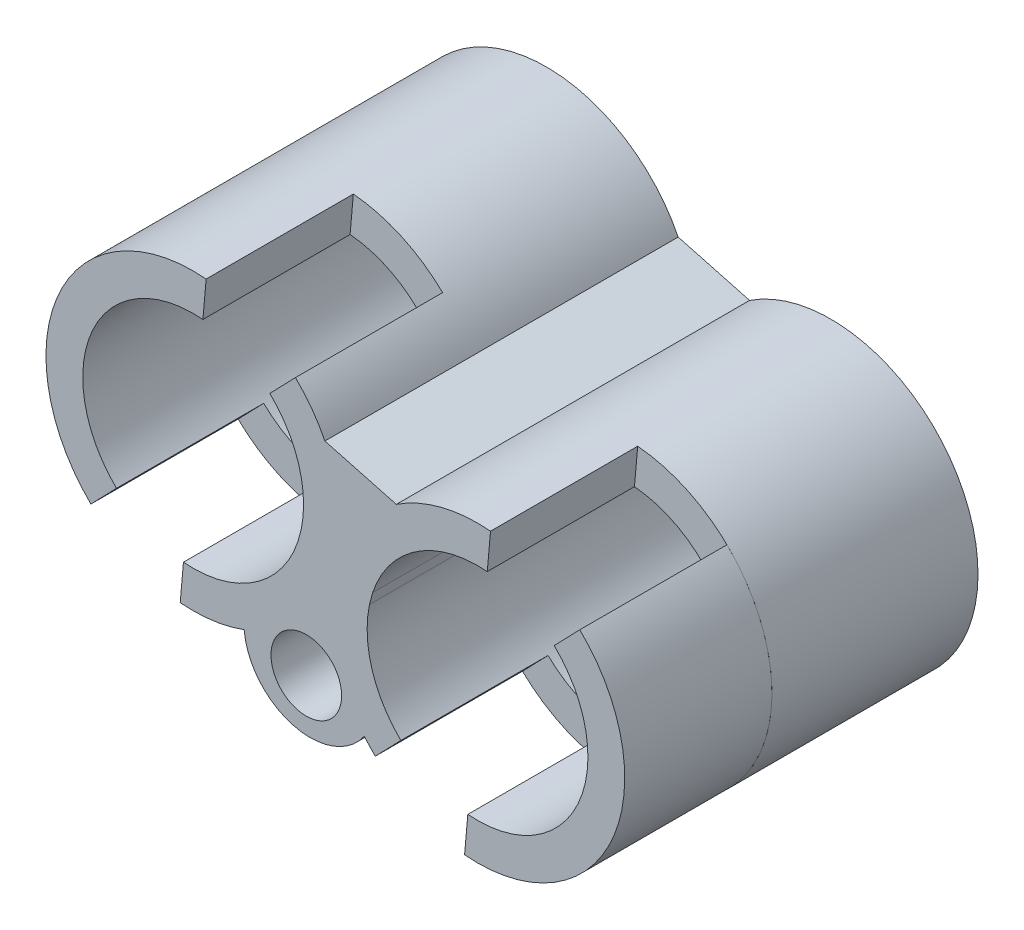
ISO-10303-21;
HEADER;
FILE_DESCRIPTION(('STEP AP214'),'2;1');
FILE_NAME('part.step','',(''),(''),'','','');
FILE_SCHEMA(('AUTOMOTIVE_DESIGN { 1 0 10303 214 1 1 1 1 }'));
ENDSEC;
DATA;
#1=APPLICATION_CONTEXT('core data for automotive mechanical design processes');
#2=APPLICATION_PROTOCOL_DEFINITION('international standard','automotive_design',2000,#1);
#3=PRODUCT_CONTEXT('',#1,'mechanical');
#4=PRODUCT('Part','Part','',(#3));
#5=PRODUCT_RELATED_PRODUCT_CATEGORY('part','',(#4));
#6=PRODUCT_DEFINITION_FORMATION('','',#4);
#7=PRODUCT_DEFINITION_CONTEXT('part definition',#1,'design');
#8=PRODUCT_DEFINITION('design','',#6,#7);
#9=PRODUCT_DEFINITION_SHAPE('','',#8);
#10=(LENGTH_UNIT() NAMED_UNIT(*) SI_UNIT(.MILLI.,.METRE.));
#11=(NAMED_UNIT(*) PLANE_ANGLE_UNIT() SI_UNIT($,.RADIAN.));
#12=(NAMED_UNIT(*) SI_UNIT($,.STERADIAN.) SOLID_ANGLE_UNIT());
#13=UNCERTAINTY_MEASURE_WITH_UNIT(LENGTH_MEASURE(1.E-05),#10,'distance_accuracy_value','');
#14=(GEOMETRIC_REPRESENTATION_CONTEXT(3) GLOBAL_UNCERTAINTY_ASSIGNED_CONTEXT((#13)) GLOBAL_UNIT_ASSIGNED_CONTEXT((#10,
#11,#12)) REPRESENTATION_CONTEXT('',''));
#15=CARTESIAN_POINT('',(0.,0.,0.));
#16=DIRECTION('',(0.,0.,1.));
#17=DIRECTION('',(1.,0.,0.));
#18=AXIS2_PLACEMENT_3D('',#15,#16,#17);
#19=CARTESIAN_POINT('',(19.3185165257814,-5.17638090205016,24.));
#20=DIRECTION('',(0.,0.,-1.));
#21=DIRECTION('',(-1.,0.,0.));
#22=AXIS2_PLACEMENT_3D('',#19,#20,#21);
#23=CYLINDRICAL_SURFACE('',#22,7.5);
#24=CARTESIAN_POINT('',(19.3185165257814,-5.17638090205016,14.));
#25=DIRECTION('',(0.,0.,1.));
#26=DIRECTION('',(1.,0.,0.));
#27=AXIS2_PLACEMENT_3D('',#24,#25,#26);
#28=CIRCLE('',#27,7.5);
#29=CARTESIAN_POINT('',(18.6579738156018,-12.6472364974976,14.));
#30=VERTEX_POINT('',#29);
#31=CARTESIAN_POINT('',(24.5279987695268,0.219107468069976,14.));
#32=VERTEX_POINT('',#31);
#33=EDGE_CURVE('E185',#30,#32,#28,.T.);
#34=ORIENTED_EDGE('',*,*,#33,.F.);
#35=DIRECTION('',(0.,0.,-1.));
#36=VECTOR('',#35,1.);
#37=CARTESIAN_POINT('',(18.6579738156018,-12.6472364974976,24.));
#38=LINE('',#37,#36);
#39=CARTESIAN_POINT('',(18.6579738156018,-12.6472364974976,24.));
#40=VERTEX_POINT('',#39);
#41=EDGE_CURVE('E13',#40,#30,#38,.T.);
#42=ORIENTED_EDGE('',*,*,#41,.F.);
#43=CARTESIAN_POINT('',(19.3185165257814,-5.17638090205016,24.));
#44=DIRECTION('',(0.,0.,1.));
#45=DIRECTION('',(1.,0.,0.));
#46=AXIS2_PLACEMENT_3D('',#43,#44,#45);
#47=CIRCLE('',#46,7.5);
#48=CARTESIAN_POINT('',(24.5279987695268,0.219107468069976,24.));
#49=VERTEX_POINT('',#48);
#50=EDGE_CURVE('E170',#40,#49,#47,.T.);
#51=ORIENTED_EDGE('',*,*,#50,.T.);
#52=DIRECTION('',(0.,0.,-1.));
#53=VECTOR('',#52,1.);
#54=CARTESIAN_POINT('',(24.5279987695268,0.219107468069976,24.));
#55=LINE('',#54,#53);
#56=EDGE_CURVE('E138',#49,#32,#55,.T.);
#57=ORIENTED_EDGE('',*,*,#56,.T.);
#58=EDGE_LOOP('',(#34,#42,#51,#57));
#59=FACE_BOUND('',#58,.T.);
#60=ADVANCED_FACE('F122',(#59),#23,.F.);
#61=CARTESIAN_POINT('',(19.6227923130935,-1.73496760179407,24.));
#62=DIRECTION('',(0.996114079392994,-0.0880723613572872,0.));
#63=DIRECTION('',(0.0880723613572872,0.996114079392994,0.));
#64=AXIS2_PLACEMENT_3D('',#61,#62,#63);
#65=PLANE('',#64);
#66=DIRECTION('',(-0.0880723613572873,-0.996114079392994,0.));
#67=VECTOR('',#66,1.);
#68=CARTESIAN_POINT('',(19.6227923130935,-1.73496760179407,14.));
#69=LINE('',#68,#67);
#70=CARTESIAN_POINT('',(18.4377929122086,-15.1375216959801,14.));
#71=VERTEX_POINT('',#70);
#72=EDGE_CURVE('E176',#30,#71,#69,.T.);
#73=ORIENTED_EDGE('',*,*,#72,.T.);
#74=DIRECTION('',(0.,0.,-1.));
#75=VECTOR('',#74,1.);
#76=CARTESIAN_POINT('',(18.4377929122086,-15.1375216959801,24.));
#77=LINE('',#76,#75);
#78=CARTESIAN_POINT('',(18.4377929122086,-15.1375216959801,24.));
#79=VERTEX_POINT('',#78);
#80=EDGE_CURVE('E130',#79,#71,#77,.T.);
#81=ORIENTED_EDGE('',*,*,#80,.F.);
#82=DIRECTION('',(-0.0880723613572873,-0.996114079392994,0.));
#83=VECTOR('',#82,1.);
#84=CARTESIAN_POINT('',(19.6227923130935,-1.73496760179407,24.));
#85=LINE('',#84,#83);
#86=EDGE_CURVE('E164',#40,#79,#85,.T.);
#87=ORIENTED_EDGE('',*,*,#86,.F.);
#88=ORIENTED_EDGE('',*,*,#41,.T.);
#89=EDGE_LOOP('',(#73,#81,#87,#88));
#90=FACE_BOUND('',#89,.T.);
#91=ADVANCED_FACE('F174',(#90),#65,.F.);
#92=CARTESIAN_POINT('',(19.3185165257814,-5.17638090205016,24.));
#93=DIRECTION('',(0.,0.,-1.));
#94=DIRECTION('',(-1.,0.,0.));
#95=AXIS2_PLACEMENT_3D('',#92,#93,#94);
#96=CYLINDRICAL_SURFACE('',#95,10.);
#97=CARTESIAN_POINT('',(19.3185165257814,-5.17638090205016,14.));
#98=DIRECTION('',(0.,0.,1.));
#99=DIRECTION('',(1.,0.,0.));
#100=AXIS2_PLACEMENT_3D('',#97,#98,#99);
#101=CIRCLE('',#100,10.);
#102=CARTESIAN_POINT('',(26.2644928507753,2.01760359144336,14.));
#103=VERTEX_POINT('',#102);
#104=EDGE_CURVE('E188',#71,#103,#101,.T.);
#105=ORIENTED_EDGE('',*,*,#104,.T.);
#106=DIRECTION('',(0.,0.,-1.));
#107=VECTOR('',#106,1.);
#108=CARTESIAN_POINT('',(26.2644928507753,2.01760359144336,24.));
#109=LINE('',#108,#107);
#110=CARTESIAN_POINT('',(26.2644928507753,2.01760359144336,24.));
#111=VERTEX_POINT('',#110);
#112=EDGE_CURVE('E152',#111,#103,#109,.T.);
#113=ORIENTED_EDGE('',*,*,#112,.F.);
#114=CARTESIAN_POINT('',(19.3185165257814,-5.17638090205016,24.));
#115=DIRECTION('',(0.,0.,1.));
#116=DIRECTION('',(1.,0.,0.));
#117=AXIS2_PLACEMENT_3D('',#114,#115,#116);
#118=CIRCLE('',#117,10.);
#119=EDGE_CURVE('E169',#79,#111,#118,.T.);
#120=ORIENTED_EDGE('',*,*,#119,.F.);
#121=ORIENTED_EDGE('',*,*,#80,.T.);
#122=EDGE_LOOP('',(#105,#113,#120,#121));
#123=FACE_BOUND('',#122,.T.);
#124=ADVANCED_FACE('F179',(#123),#96,.T.);
#125=CARTESIAN_POINT('',(12.5845901278236,-12.1507441622472,24.));
#126=DIRECTION('',(-0.719398449349352,0.694597632499383,0.));
#127=DIRECTION('',(-0.694597632499383,-0.719398449349352,0.));
#128=AXIS2_PLACEMENT_3D('',#125,#126,#127);
#129=PLANE('',#128);
#130=DIRECTION('',(0.694597632499383,0.719398449349352,0.));
#131=VECTOR('',#130,1.);
#132=CARTESIAN_POINT('',(12.5845901278236,-12.1507441622472,14.));
#133=LINE('',#132,#131);
#134=EDGE_CURVE('E190',#32,#103,#133,.T.);
#135=ORIENTED_EDGE('',*,*,#134,.F.);
#136=ORIENTED_EDGE('',*,*,#56,.F.);
#137=DIRECTION('',(0.694597632499383,0.719398449349352,0.));
#138=VECTOR('',#137,1.);
#139=CARTESIAN_POINT('',(12.5845901278236,-12.1507441622472,24.));
#140=LINE('',#139,#138);
#141=EDGE_CURVE('E180',#49,#111,#140,.T.);
#142=ORIENTED_EDGE('',*,*,#141,.T.);
#143=ORIENTED_EDGE('',*,*,#112,.T.);
#144=EDGE_LOOP('',(#135,#136,#142,#143));
#145=FACE_BOUND('',#144,.T.);
#146=ADVANCED_FACE('F195',(#145),#129,.T.);
#147=CARTESIAN_POINT('',(0.,0.,24.));
#148=DIRECTION('',(0.,0.,1.));
#149=DIRECTION('',(1.,0.,0.));
#150=AXIS2_PLACEMENT_3D('',#147,#148,#149);
#151=PLANE('',#150);
#152=ORIENTED_EDGE('',*,*,#50,.F.);
#153=ORIENTED_EDGE('',*,*,#86,.T.);
#154=ORIENTED_EDGE('',*,*,#119,.T.);
#155=ORIENTED_EDGE('',*,*,#141,.F.);
#156=EDGE_LOOP('',(#152,#153,#154,#155));
#157=FACE_BOUND('',#156,.T.);
#158=ADVANCED_FACE('F166',(#157),#151,.T.);
#159=CARTESIAN_POINT('',(0.,0.,14.));
#160=DIRECTION('',(0.,0.,1.));
#161=DIRECTION('',(1.,0.,0.));
#162=AXIS2_PLACEMENT_3D('',#159,#160,#161);
#163=PLANE('',#162);
#164=ORIENTED_EDGE('',*,*,#33,.T.);
#165=ORIENTED_EDGE('',*,*,#134,.T.);
#166=ORIENTED_EDGE('',*,*,#104,.F.);
#167=ORIENTED_EDGE('',*,*,#72,.F.);
#168=EDGE_LOOP('',(#164,#165,#166,#167));
#169=FACE_BOUND('',#168,.T.);
#170=ADVANCED_FACE('F202',(#169),#163,.F.);
#171=CLOSED_SHELL('',(#60,#91,#124,#146,#158,#170));
#172=MANIFOLD_SOLID_BREP('B2',#171);
#173=CARTESIAN_POINT('',(0.,0.,14.));
#174=DIRECTION('',(0.,0.,1.));
#175=DIRECTION('',(1.,0.,0.));
#176=AXIS2_PLACEMENT_3D('',#173,#174,#175);
#177=PLANE('',#176);
#178=CARTESIAN_POINT('',(19.3185165257814,-5.17638090205016,14.));
#179=DIRECTION('',(0.,0.,1.));
#180=DIRECTION('',(1.,0.,0.));
#181=AXIS2_PLACEMENT_3D('',#178,#179,#180);
#182=CIRCLE('',#181,10.);
#183=CARTESIAN_POINT('',(12.3725402007876,-12.3703653955437,14.));
#184=VERTEX_POINT('',#183);
#185=CARTESIAN_POINT('',(20.1992401393543,4.78475989187978,14.));
#186=VERTEX_POINT('',#185);
#187=EDGE_CURVE('E457',#184,#186,#182,.T.);
#188=ORIENTED_EDGE('',*,*,#187,.T.);
#189=DIRECTION('',(0.0880723613572873,0.996114079392994,0.));
#190=VECTOR('',#189,1.);
#191=CARTESIAN_POINT('',(19.6227923130935,-1.73496760179407,14.));
#192=LINE('',#191,#190);
#193=CARTESIAN_POINT('',(19.9790592359611,2.2944746933973,14.));
#194=VERTEX_POINT('',#193);
#195=EDGE_CURVE('E389',#194,#186,#192,.T.);
#196=ORIENTED_EDGE('',*,*,#195,.F.);
#197=CARTESIAN_POINT('',(19.3185165257814,-5.17638090205016,14.));
#198=DIRECTION('',(0.,0.,1.));
#199=DIRECTION('',(1.,0.,0.));
#200=AXIS2_PLACEMENT_3D('',#197,#198,#199);
#201=CIRCLE('',#200,7.5);
#202=CARTESIAN_POINT('',(14.1090342820361,-10.5718692721703,14.));
#203=VERTEX_POINT('',#202);
#204=EDGE_CURVE('E448',#203,#194,#201,.T.);
#205=ORIENTED_EDGE('',*,*,#204,.F.);
#206=DIRECTION('',(0.694597632499384,0.719398449349351,0.));
#207=VECTOR('',#206,1.);
#208=CARTESIAN_POINT('',(12.5845901278235,-12.1507441622472,14.));
#209=LINE('',#208,#207);
#210=EDGE_CURVE('E889',#184,#203,#209,.T.);
#211=ORIENTED_EDGE('',*,*,#210,.F.);
#212=EDGE_LOOP('',(#188,#196,#205,#211));
#213=FACE_BOUND('',#212,.T.);
#214=ADVANCED_FACE('F245',(#213),#177,.T.);
#215=CARTESIAN_POINT('',(0.,0.,14.));
#216=DIRECTION('',(0.,0.,1.));
#217=DIRECTION('',(1.,0.,0.));
#218=AXIS2_PLACEMENT_3D('',#215,#216,#217);
#219=PLANE('',#218);
#220=CARTESIAN_POINT('',(0.,0.,14.));
#221=DIRECTION('',(0.,0.,1.));
#222=DIRECTION('',(1.,0.,0.));
#223=AXIS2_PLACEMENT_3D('',#220,#221,#222);
#224=CIRCLE('',#223,10.);
#225=CARTESIAN_POINT('',(-6.94597632499384,-7.19398449349351,14.));
#226=VERTEX_POINT('',#225);
#227=CARTESIAN_POINT('',(-0.880723613572865,-9.96114079392994,14.));
#228=VERTEX_POINT('',#227);
#229=EDGE_CURVE('E421',#226,#228,#224,.T.);
#230=ORIENTED_EDGE('',*,*,#229,.T.);
#231=DIRECTION('',(-0.0880723613572865,-0.996114079392994,0.));
#232=VECTOR('',#231,1.);
#233=CARTESIAN_POINT('',(0.,0.,14.));
#234=LINE('',#233,#232);
#235=CARTESIAN_POINT('',(-0.660542710179649,-7.47085559544745,14.));
#236=VERTEX_POINT('',#235);
#237=EDGE_CURVE('E478',#236,#228,#234,.T.);
#238=ORIENTED_EDGE('',*,*,#237,.F.);
#239=CARTESIAN_POINT('',(0.,0.,14.));
#240=DIRECTION('',(0.,0.,1.));
#241=DIRECTION('',(1.,0.,0.));
#242=AXIS2_PLACEMENT_3D('',#239,#240,#241);
#243=CIRCLE('',#242,7.5);
#244=CARTESIAN_POINT('',(-5.20948224374538,-5.39548837012014,14.));
#245=VERTEX_POINT('',#244);
#246=EDGE_CURVE('E409',#245,#236,#243,.T.);
#247=ORIENTED_EDGE('',*,*,#246,.F.);
#248=DIRECTION('',(0.694597632499383,0.719398449349351,0.));
#249=VECTOR('',#248,1.);
#250=CARTESIAN_POINT('',(0.,0.,14.));
#251=LINE('',#250,#249);
#252=EDGE_CURVE('E512',#226,#245,#251,.T.);
#253=ORIENTED_EDGE('',*,*,#252,.F.);
#254=EDGE_LOOP('',(#230,#238,#247,#253));
#255=FACE_BOUND('',#254,.T.);
#256=ADVANCED_FACE('F592',(#255),#219,.T.);
#257=CARTESIAN_POINT('',(0.,0.,2.));
#258=DIRECTION('',(0.,0.,-1.));
#259=DIRECTION('',(-1.,0.,0.));
#260=AXIS2_PLACEMENT_3D('',#257,#258,#259);
#261=CYLINDRICAL_SURFACE('',#260,3.285);
#262=CARTESIAN_POINT('',(0.,0.,2.));
#263=DIRECTION('',(0.,0.,1.));
#264=DIRECTION('',(1.,0.,0.));
#265=AXIS2_PLACEMENT_3D('',#262,#263,#264);
#266=CIRCLE('',#265,3.285);
#267=CARTESIAN_POINT('',(3.285,0.,2.));
#268=VERTEX_POINT('',#267);
#269=EDGE_CURVE('E422',#268,#268,#266,.T.);
#270=ORIENTED_EDGE('',*,*,#269,.T.);
#271=EDGE_LOOP('',(#270));
#272=FACE_BOUND('',#271,.T.);
#273=CARTESIAN_POINT('',(0.,0.,0.));
#274=DIRECTION('',(0.,0.,1.));
#275=DIRECTION('',(1.,0.,0.));
#276=AXIS2_PLACEMENT_3D('',#273,#274,#275);
#277=CIRCLE('',#276,3.285);
#278=CARTESIAN_POINT('',(3.285,0.,0.));
#279=VERTEX_POINT('',#278);
#280=EDGE_CURVE('E420',#279,#279,#277,.T.);
#281=ORIENTED_EDGE('',*,*,#280,.F.);
#282=EDGE_LOOP('',(#281));
#283=FACE_BOUND('',#282,.T.);
#284=ADVANCED_FACE('F247',(#272,#283),#261,.F.);
#285=CARTESIAN_POINT('',(0.,0.,2.));
#286=DIRECTION('',(0.,0.,1.));
#287=DIRECTION('',(1.,0.,0.));
#288=AXIS2_PLACEMENT_3D('',#285,#286,#287);
#289=PLANE('',#288);
#290=DIRECTION('',(-0.258819045102508,-0.965925826289072,0.));
#291=VECTOR('',#290,1.);
#292=CARTESIAN_POINT('',(7.23315714966661,-1.93811861698047,2.));
#293=LINE('',#292,#291);
#294=CARTESIAN_POINT('',(7.34147033019424,-1.53388832412197,2.));
#295=VERTEX_POINT('',#294);
#296=CARTESIAN_POINT('',(7.124843969139,-2.34234890983894,2.));
#297=VERTEX_POINT('',#296);
#298=EDGE_CURVE('E473',#295,#297,#293,.T.);
#299=ORIENTED_EDGE('',*,*,#298,.F.);
#300=CARTESIAN_POINT('',(0.,0.,2.));
#301=DIRECTION('',(0.,0.,1.));
#302=DIRECTION('',(1.,0.,0.));
#303=AXIS2_PLACEMENT_3D('',#300,#301,#302);
#304=CIRCLE('',#303,7.5);
#305=EDGE_CURVE('E418',#297,#295,#304,.F.);
#306=ORIENTED_EDGE('',*,*,#305,.F.);
#307=EDGE_LOOP('',(#299,#306));
#308=FACE_BOUND('',#307,.T.);
#309=ORIENTED_EDGE('',*,*,#269,.F.);
#310=EDGE_LOOP('',(#309));
#311=FACE_BOUND('',#310,.T.);
#312=ADVANCED_FACE('F567',(#308,#311),#289,.T.);
#313=CARTESIAN_POINT('',(0.,0.,0.));
#314=DIRECTION('',(0.,0.,1.));
#315=DIRECTION('',(1.,0.,0.));
#316=AXIS2_PLACEMENT_3D('',#313,#314,#315);
#317=PLANE('',#316);
#318=ORIENTED_EDGE('',*,*,#280,.T.);
#319=EDGE_LOOP('',(#318));
#320=FACE_BOUND('',#319,.T.);
#321=CARTESIAN_POINT('',(19.3185165257814,-5.17638090205016,0.));
#322=DIRECTION('',(0.,0.,1.));
#323=DIRECTION('',(1.,0.,0.));
#324=AXIS2_PLACEMENT_3D('',#321,#322,#323);
#325=CIRCLE('',#324,10.);
#326=CARTESIAN_POINT('',(11.6281366871362,-11.5684117168507,0.));
#327=VERTEX_POINT('',#326);
#328=CARTESIAN_POINT('',(13.8007094970205,3.16351151892005,0.));
#329=VERTEX_POINT('',#328);
#330=EDGE_CURVE('E399',#327,#329,#325,.T.);
#331=ORIENTED_EDGE('',*,*,#330,.F.);
#332=CARTESIAN_POINT('',(7.94390814198503,-8.98996425501482,0.));
#333=DIRECTION('',(0.,0.,1.));
#334=DIRECTION('',(1.,0.,0.));
#335=AXIS2_PLACEMENT_3D('',#332,#333,#334);
#336=CIRCLE('',#335,4.49688017255906);
#337=CARTESIAN_POINT('',(3.46404889761839,-9.38085098671271,0.));
#338=VERTEX_POINT('',#337);
#339=EDGE_CURVE('E384',#338,#327,#336,.T.);
#340=ORIENTED_EDGE('',*,*,#339,.F.);
#341=CARTESIAN_POINT('',(0.,0.,0.));
#342=DIRECTION('',(0.,0.,1.));
#343=DIRECTION('',(1.,0.,0.));
#344=AXIS2_PLACEMENT_3D('',#341,#342,#343);
#345=CIRCLE('',#344,10.);
#346=CARTESIAN_POINT('',(8.94850727057229,4.46365518700927,0.));
#347=VERTEX_POINT('',#346);
#348=EDGE_CURVE('E398',#347,#338,#345,.T.);
#349=ORIENTED_EDGE('',*,*,#348,.F.);
#350=DIRECTION('',(-0.965925826289072,0.258819045102508,0.));
#351=VECTOR('',#350,1.);
#352=CARTESIAN_POINT('',(13.8007094970205,3.16351151892005,0.));
#353=LINE('',#352,#351);
#354=EDGE_CURVE('E460',#329,#347,#353,.T.);
#355=ORIENTED_EDGE('',*,*,#354,.F.);
#356=EDGE_LOOP('',(#331,#340,#349,#355));
#357=FACE_BOUND('',#356,.T.);
#358=CARTESIAN_POINT('',(19.3185165257814,-5.17638090205016,0.));
#359=DIRECTION('',(0.,0.,1.));
#360=DIRECTION('',(1.,0.,0.));
#361=AXIS2_PLACEMENT_3D('',#358,#359,#360);
#362=CIRCLE('',#361,3.285);
#363=CARTESIAN_POINT('',(22.6035165257814,-5.17638090205016,0.));
#364=VERTEX_POINT('',#363);
#365=EDGE_CURVE('E451',#364,#364,#362,.T.);
#366=ORIENTED_EDGE('',*,*,#365,.T.);
#367=EDGE_LOOP('',(#366));
#368=FACE_BOUND('',#367,.T.);
#369=ADVANCED_FACE('F395',(#320,#357,#368),#317,.F.);
#370=CARTESIAN_POINT('',(0.,0.,14.));
#371=DIRECTION('',(0.,0.,-1.));
#372=DIRECTION('',(-1.,0.,0.));
#373=AXIS2_PLACEMENT_3D('',#370,#371,#372);
#374=CYLINDRICAL_SURFACE('',#373,7.5);
#375=DIRECTION('',(0.,0.,-1.));
#376=VECTOR('',#375,1.);
#377=CARTESIAN_POINT('',(-0.660542710179649,-7.47085559544745,24.));
#378=LINE('',#377,#376);
#379=CARTESIAN_POINT('',(-0.660542710179649,-7.47085559544745,24.));
#380=VERTEX_POINT('',#379);
#381=EDGE_CURVE('E504',#380,#236,#378,.T.);
#382=ORIENTED_EDGE('',*,*,#381,.F.);
#383=CARTESIAN_POINT('',(0.,0.,24.));
#384=DIRECTION('',(0.,0.,1.));
#385=DIRECTION('',(1.,0.,0.));
#386=AXIS2_PLACEMENT_3D('',#383,#384,#385);
#387=CIRCLE('',#386,7.5);
#388=CARTESIAN_POINT('',(7.12484396913899,-2.34234890983897,24.));
#389=VERTEX_POINT('',#388);
#390=EDGE_CURVE('E483',#389,#380,#387,.F.);
#391=ORIENTED_EDGE('',*,*,#390,.F.);
#392=DIRECTION('',(0.,0.,-1.));
#393=VECTOR('',#392,1.);
#394=CARTESIAN_POINT('',(7.124843969139,-2.34234890983894,14.));
#395=LINE('',#394,#393);
#396=EDGE_CURVE('E469',#297,#389,#395,.F.);
#397=ORIENTED_EDGE('',*,*,#396,.F.);
#398=ORIENTED_EDGE('',*,*,#305,.T.);
#399=DIRECTION('',(0.,0.,-1.));
#400=VECTOR('',#399,1.);
#401=CARTESIAN_POINT('',(7.34147033019423,-1.533888324122,14.));
#402=LINE('',#401,#400);
#403=CARTESIAN_POINT('',(7.34147033019424,-1.53388832412197,24.));
#404=VERTEX_POINT('',#403);
#405=EDGE_CURVE('E475',#404,#295,#402,.T.);
#406=ORIENTED_EDGE('',*,*,#405,.F.);
#407=CARTESIAN_POINT('',(5.20948224374538,5.39548837012013,24.));
#408=VERTEX_POINT('',#407);
#409=EDGE_CURVE('E479',#408,#404,#387,.F.);
#410=ORIENTED_EDGE('',*,*,#409,.F.);
#411=DIRECTION('',(0.,0.,-1.));
#412=VECTOR('',#411,1.);
#413=CARTESIAN_POINT('',(5.20948224374538,5.39548837012013,24.));
#414=LINE('',#413,#412);
#415=CARTESIAN_POINT('',(5.20948224374538,5.39548837012013,14.));
#416=VERTEX_POINT('',#415);
#417=EDGE_CURVE('E491',#408,#416,#414,.T.);
#418=ORIENTED_EDGE('',*,*,#417,.T.);
#419=CARTESIAN_POINT('',(0.660542710179649,7.47085559544745,14.));
#420=VERTEX_POINT('',#419);
#421=EDGE_CURVE('E406',#416,#420,#243,.T.);
#422=ORIENTED_EDGE('',*,*,#421,.T.);
#423=DIRECTION('',(0.,0.,-1.));
#424=VECTOR('',#423,1.);
#425=CARTESIAN_POINT('',(0.660542710179649,7.47085559544745,24.));
#426=LINE('',#425,#424);
#427=CARTESIAN_POINT('',(0.660542710179649,7.47085559544745,24.));
#428=VERTEX_POINT('',#427);
#429=EDGE_CURVE('E407',#428,#420,#426,.T.);
#430=ORIENTED_EDGE('',*,*,#429,.F.);
#431=CARTESIAN_POINT('',(0.,0.,24.));
#432=DIRECTION('',(0.,0.,1.));
#433=DIRECTION('',(1.,0.,0.));
#434=AXIS2_PLACEMENT_3D('',#431,#432,#433);
#435=CIRCLE('',#434,7.5);
#436=CARTESIAN_POINT('',(-5.20948224374538,-5.39548837012014,24.));
#437=VERTEX_POINT('',#436);
#438=EDGE_CURVE('E508',#437,#428,#435,.F.);
#439=ORIENTED_EDGE('',*,*,#438,.F.);
#440=DIRECTION('',(0.,0.,-1.));
#441=VECTOR('',#440,1.);
#442=CARTESIAN_POINT('',(-5.20948224374538,-5.39548837012014,24.));
#443=LINE('',#442,#441);
#444=EDGE_CURVE('E517',#437,#245,#443,.T.);
#445=ORIENTED_EDGE('',*,*,#444,.T.);
#446=ORIENTED_EDGE('',*,*,#246,.T.);
#447=EDGE_LOOP('',(#382,#391,#397,#398,#406,#410,#418,#422,#430,#439,#445,#446));
#448=FACE_BOUND('',#447,.T.);
#449=ADVANCED_FACE('F553',(#448),#374,.F.);
#450=CARTESIAN_POINT('',(0.,0.,14.));
#451=DIRECTION('',(0.,0.,-1.));
#452=DIRECTION('',(-1.,0.,0.));
#453=AXIS2_PLACEMENT_3D('',#450,#451,#452);
#454=CYLINDRICAL_SURFACE('',#453,10.);
#455=ORIENTED_EDGE('',*,*,#348,.T.);
#456=DIRECTION('',(0.,0.,1.));
#457=VECTOR('',#456,1.);
#458=CARTESIAN_POINT('',(3.46404889761839,-9.38085098671271,12.));
#459=LINE('',#458,#457);
#460=CARTESIAN_POINT('',(3.46404889761839,-9.38085098671271,24.));
#461=VERTEX_POINT('',#460);
#462=EDGE_CURVE('E381',#338,#461,#459,.T.);
#463=ORIENTED_EDGE('',*,*,#462,.T.);
#464=CARTESIAN_POINT('',(0.,0.,24.));
#465=DIRECTION('',(0.,0.,1.));
#466=DIRECTION('',(1.,0.,0.));
#467=AXIS2_PLACEMENT_3D('',#464,#465,#466);
#468=CIRCLE('',#467,10.);
#469=CARTESIAN_POINT('',(-0.880723613572865,-9.96114079392994,24.));
#470=VERTEX_POINT('',#469);
#471=EDGE_CURVE('E486',#470,#461,#468,.T.);
#472=ORIENTED_EDGE('',*,*,#471,.F.);
#473=DIRECTION('',(0.,0.,-1.));
#474=VECTOR('',#473,1.);
#475=CARTESIAN_POINT('',(-0.880723613572865,-9.96114079392994,24.));
#476=LINE('',#475,#474);
#477=EDGE_CURVE('E501',#470,#228,#476,.T.);
#478=ORIENTED_EDGE('',*,*,#477,.T.);
#479=ORIENTED_EDGE('',*,*,#229,.F.);
#480=DIRECTION('',(0.,0.,-1.));
#481=VECTOR('',#480,1.);
#482=CARTESIAN_POINT('',(-6.94597632499384,-7.19398449349351,24.));
#483=LINE('',#482,#481);
#484=CARTESIAN_POINT('',(-6.94597632499384,-7.19398449349351,24.));
#485=VERTEX_POINT('',#484);
#486=EDGE_CURVE('E525',#485,#226,#483,.T.);
#487=ORIENTED_EDGE('',*,*,#486,.F.);
#488=CARTESIAN_POINT('',(0.,0.,24.));
#489=DIRECTION('',(0.,0.,1.));
#490=DIRECTION('',(1.,0.,0.));
#491=AXIS2_PLACEMENT_3D('',#488,#489,#490);
#492=CIRCLE('',#491,10.);
#493=CARTESIAN_POINT('',(0.880723613572866,9.96114079392994,24.));
#494=VERTEX_POINT('',#493);
#495=EDGE_CURVE('E514',#494,#485,#492,.T.);
#496=ORIENTED_EDGE('',*,*,#495,.F.);
#497=DIRECTION('',(0.,0.,-1.));
#498=VECTOR('',#497,1.);
#499=CARTESIAN_POINT('',(0.880723613572866,9.96114079392994,24.));
#500=LINE('',#499,#498);
#501=CARTESIAN_POINT('',(0.880723613572866,9.96114079392994,14.));
#502=VERTEX_POINT('',#501);
#503=EDGE_CURVE('E412',#494,#502,#500,.T.);
#504=ORIENTED_EDGE('',*,*,#503,.T.);
#505=CARTESIAN_POINT('',(6.94597632499384,7.19398449349351,14.));
#506=VERTEX_POINT('',#505);
#507=EDGE_CURVE('E434',#506,#502,#224,.T.);
#508=ORIENTED_EDGE('',*,*,#507,.F.);
#509=DIRECTION('',(0.,0.,-1.));
#510=VECTOR('',#509,1.);
#511=CARTESIAN_POINT('',(6.94597632499384,7.19398449349351,24.));
#512=LINE('',#511,#510);
#513=CARTESIAN_POINT('',(6.94597632499384,7.19398449349351,24.));
#514=VERTEX_POINT('',#513);
#515=EDGE_CURVE('E498',#514,#506,#512,.T.);
#516=ORIENTED_EDGE('',*,*,#515,.F.);
#517=CARTESIAN_POINT('',(8.9485072705723,4.46365518700927,24.));
#518=VERTEX_POINT('',#517);
#519=EDGE_CURVE('E485',#518,#514,#468,.T.);
#520=ORIENTED_EDGE('',*,*,#519,.F.);
#521=DIRECTION('',(0.,0.,1.));
#522=VECTOR('',#521,1.);
#523=CARTESIAN_POINT('',(8.94850727057229,4.46365518700927,0.));
#524=LINE('',#523,#522);
#525=EDGE_CURVE('E405',#347,#518,#524,.T.);
#526=ORIENTED_EDGE('',*,*,#525,.F.);
#527=EDGE_LOOP('',(#455,#463,#472,#478,#479,#487,#496,#504,#508,#516,#520,#526));
#528=FACE_BOUND('',#527,.T.);
#529=ADVANCED_FACE('F402',(#528),#454,.T.);
#530=DIRECTION('',(0.694597632499383,0.719398449349351,0.));
#531=VECTOR('',#530,1.);
#532=CARTESIAN_POINT('',(0.,0.,14.));
#533=LINE('',#532,#531);
#534=EDGE_CURVE('E494',#416,#506,#533,.T.);
#535=ORIENTED_EDGE('',*,*,#534,.T.);
#536=ORIENTED_EDGE('',*,*,#507,.T.);
#537=DIRECTION('',(0.0880723613572865,0.996114079392994,0.));
#538=VECTOR('',#537,1.);
#539=CARTESIAN_POINT('',(0.,0.,14.));
#540=LINE('',#539,#538);
#541=EDGE_CURVE('E507',#420,#502,#540,.T.);
#542=ORIENTED_EDGE('',*,*,#541,.F.);
#543=ORIENTED_EDGE('',*,*,#421,.F.);
#544=EDGE_LOOP('',(#535,#536,#542,#543));
#545=FACE_BOUND('',#544,.T.);
#546=ADVANCED_FACE('F577',(#545),#219,.T.);
#547=CARTESIAN_POINT('',(0.,0.,24.));
#548=DIRECTION('',(-0.996114079392994,0.0880723613572865,0.));
#549=DIRECTION('',(-0.0880723613572865,-0.996114079392994,0.));
#550=AXIS2_PLACEMENT_3D('',#547,#548,#549);
#551=PLANE('',#550);
#552=ORIENTED_EDGE('',*,*,#541,.T.);
#553=ORIENTED_EDGE('',*,*,#503,.F.);
#554=DIRECTION('',(0.0880723613572865,0.996114079392994,0.));
#555=VECTOR('',#554,1.);
#556=CARTESIAN_POINT('',(0.,0.,24.));
#557=LINE('',#556,#555);
#558=EDGE_CURVE('E511',#428,#494,#557,.T.);
#559=ORIENTED_EDGE('',*,*,#558,.F.);
#560=ORIENTED_EDGE('',*,*,#429,.T.);
#561=EDGE_LOOP('',(#552,#553,#559,#560));
#562=FACE_BOUND('',#561,.T.);
#563=ADVANCED_FACE('F580',(#562),#551,.F.);
#564=CARTESIAN_POINT('',(0.,0.,24.));
#565=DIRECTION('',(-0.719398449349351,0.694597632499383,0.));
#566=DIRECTION('',(-0.694597632499383,-0.719398449349351,0.));
#567=AXIS2_PLACEMENT_3D('',#564,#565,#566);
#568=PLANE('',#567);
#569=ORIENTED_EDGE('',*,*,#252,.T.);
#570=ORIENTED_EDGE('',*,*,#444,.F.);
#571=DIRECTION('',(0.694597632499383,0.719398449349351,0.));
#572=VECTOR('',#571,1.);
#573=CARTESIAN_POINT('',(0.,0.,24.));
#574=LINE('',#573,#572);
#575=EDGE_CURVE('E516',#485,#437,#574,.T.);
#576=ORIENTED_EDGE('',*,*,#575,.F.);
#577=ORIENTED_EDGE('',*,*,#486,.T.);
#578=EDGE_LOOP('',(#569,#570,#576,#577));
#579=FACE_BOUND('',#578,.T.);
#580=ADVANCED_FACE('F541',(#579),#568,.F.);
#581=CARTESIAN_POINT('',(0.,0.,24.));
#582=DIRECTION('',(0.,0.,1.));
#583=DIRECTION('',(1.,0.,0.));
#584=AXIS2_PLACEMENT_3D('',#581,#582,#583);
#585=PLANE('',#584);
#586=ORIENTED_EDGE('',*,*,#438,.T.);
#587=ORIENTED_EDGE('',*,*,#558,.T.);
#588=ORIENTED_EDGE('',*,*,#495,.T.);
#589=ORIENTED_EDGE('',*,*,#575,.T.);
#590=EDGE_LOOP('',(#586,#587,#588,#589));
#591=FACE_BOUND('',#590,.T.);
#592=ADVANCED_FACE('F582',(#591),#585,.T.);
#593=CARTESIAN_POINT('',(0.,0.,24.));
#594=DIRECTION('',(0.996114079392994,-0.0880723613572865,0.));
#595=DIRECTION('',(0.0880723613572865,0.996114079392994,0.));
#596=AXIS2_PLACEMENT_3D('',#593,#594,#595);
#597=PLANE('',#596);
#598=ORIENTED_EDGE('',*,*,#237,.T.);
#599=ORIENTED_EDGE('',*,*,#477,.F.);
#600=DIRECTION('',(-0.0880723613572865,-0.996114079392994,0.));
#601=VECTOR('',#600,1.);
#602=CARTESIAN_POINT('',(0.,0.,24.));
#603=LINE('',#602,#601);
#604=EDGE_CURVE('E482',#380,#470,#603,.T.);
#605=ORIENTED_EDGE('',*,*,#604,.F.);
#606=ORIENTED_EDGE('',*,*,#381,.T.);
#607=EDGE_LOOP('',(#598,#599,#605,#606));
#608=FACE_BOUND('',#607,.T.);
#609=ADVANCED_FACE('F558',(#608),#597,.F.);
#610=CARTESIAN_POINT('',(0.,0.,24.));
#611=DIRECTION('',(-0.719398449349351,0.694597632499383,0.));
#612=DIRECTION('',(-0.694597632499383,-0.719398449349351,0.));
#613=AXIS2_PLACEMENT_3D('',#610,#611,#612);
#614=PLANE('',#613);
#615=ORIENTED_EDGE('',*,*,#534,.F.);
#616=ORIENTED_EDGE('',*,*,#417,.F.);
#617=DIRECTION('',(0.694597632499383,0.719398449349351,0.));
#618=VECTOR('',#617,1.);
#619=CARTESIAN_POINT('',(0.,0.,24.));
#620=LINE('',#619,#618);
#621=EDGE_CURVE('E488',#408,#514,#620,.T.);
#622=ORIENTED_EDGE('',*,*,#621,.T.);
#623=ORIENTED_EDGE('',*,*,#515,.T.);
#624=EDGE_LOOP('',(#615,#616,#622,#623));
#625=FACE_BOUND('',#624,.T.);
#626=ADVANCED_FACE('F575',(#625),#614,.T.);
#627=CARTESIAN_POINT('',(0.,0.,24.));
#628=DIRECTION('',(0.,0.,1.));
#629=DIRECTION('',(1.,0.,0.));
#630=AXIS2_PLACEMENT_3D('',#627,#628,#629);
#631=PLANE('',#630);
#632=CARTESIAN_POINT('',(7.68508909688253,-9.95589008130389,24.));
#633=DIRECTION('',(0.,0.,1.));
#634=DIRECTION('',(1.,0.,0.));
#635=AXIS2_PLACEMENT_3D('',#632,#633,#634);
#636=CIRCLE('',#635,2.4);
#637=CARTESIAN_POINT('',(10.0850890968825,-9.95589008130389,24.));
#638=VERTEX_POINT('',#637);
#639=EDGE_CURVE('E869',#638,#638,#636,.T.);
#640=ORIENTED_EDGE('',*,*,#639,.F.);
#641=EDGE_LOOP('',(#640));
#642=FACE_BOUND('',#641,.T.);
#643=DIRECTION('',(0.694597632499384,0.719398449349351,0.));
#644=VECTOR('',#643,1.);
#645=CARTESIAN_POINT('',(12.5845901278235,-12.1507441622472,24.));
#646=LINE('',#645,#644);
#647=CARTESIAN_POINT('',(12.3725402007876,-12.3703653955437,24.));
#648=VERTEX_POINT('',#647);
#649=CARTESIAN_POINT('',(14.1090342820361,-10.5718692721703,24.));
#650=VERTEX_POINT('',#649);
#651=EDGE_CURVE('E884',#648,#650,#646,.T.);
#652=ORIENTED_EDGE('',*,*,#651,.T.);
#653=CARTESIAN_POINT('',(19.3185165257814,-5.17638090205016,24.));
#654=DIRECTION('',(0.,0.,1.));
#655=DIRECTION('',(1.,0.,0.));
#656=AXIS2_PLACEMENT_3D('',#653,#654,#655);
#657=CIRCLE('',#656,7.5);
#658=CARTESIAN_POINT('',(11.9770461955872,-3.64249257792795,24.));
#659=VERTEX_POINT('',#658);
#660=EDGE_CURVE('E878',#659,#650,#657,.T.);
#661=ORIENTED_EDGE('',*,*,#660,.F.);
#662=DIRECTION('',(0.258819045102508,0.965925826289072,0.));
#663=VECTOR('',#662,1.);
#664=CARTESIAN_POINT('',(10.3700092552091,-9.64003608905943,24.));
#665=LINE('',#664,#663);
#666=CARTESIAN_POINT('',(12.1936725566424,-2.83403199221142,24.));
#667=VERTEX_POINT('',#666);
#668=EDGE_CURVE('E458',#659,#667,#665,.T.);
#669=ORIENTED_EDGE('',*,*,#668,.T.);
#670=CARTESIAN_POINT('',(19.9790592359611,2.2944746933973,24.));
#671=VERTEX_POINT('',#670);
#672=EDGE_CURVE('E441',#671,#667,#657,.T.);
#673=ORIENTED_EDGE('',*,*,#672,.F.);
#674=DIRECTION('',(0.0880723613572873,0.996114079392994,0.));
#675=VECTOR('',#674,1.);
#676=CARTESIAN_POINT('',(19.6227923130935,-1.73496760179407,24.));
#677=LINE('',#676,#675);
#678=CARTESIAN_POINT('',(20.1992401393543,4.78475989187978,24.));
#679=VERTEX_POINT('',#678);
#680=EDGE_CURVE('E877',#671,#679,#677,.T.);
#681=ORIENTED_EDGE('',*,*,#680,.T.);
#682=CARTESIAN_POINT('',(19.3185165257814,-5.17638090205016,24.));
#683=DIRECTION('',(0.,0.,1.));
#684=DIRECTION('',(1.,0.,0.));
#685=AXIS2_PLACEMENT_3D('',#682,#683,#684);
#686=CIRCLE('',#685,10.);
#687=CARTESIAN_POINT('',(13.8007094970205,3.16351151892005,24.));
#688=VERTEX_POINT('',#687);
#689=EDGE_CURVE('E881',#679,#688,#686,.T.);
#690=ORIENTED_EDGE('',*,*,#689,.T.);
#691=DIRECTION('',(-0.965925826289072,0.258819045102508,0.));
#692=VECTOR('',#691,1.);
#693=CARTESIAN_POINT('',(13.8007094970205,3.16351151892005,24.));
#694=LINE('',#693,#692);
#695=EDGE_CURVE('E465',#688,#518,#694,.T.);
#696=ORIENTED_EDGE('',*,*,#695,.T.);
#697=ORIENTED_EDGE('',*,*,#519,.T.);
#698=ORIENTED_EDGE('',*,*,#621,.F.);
#699=ORIENTED_EDGE('',*,*,#409,.T.);
#700=DIRECTION('',(-0.258819045102508,-0.965925826289072,0.));
#701=VECTOR('',#700,1.);
#702=CARTESIAN_POINT('',(8.94850727057229,4.46365518700927,24.));
#703=LINE('',#702,#701);
#704=EDGE_CURVE('E463',#404,#389,#703,.T.);
#705=ORIENTED_EDGE('',*,*,#704,.T.);
#706=ORIENTED_EDGE('',*,*,#390,.T.);
#707=ORIENTED_EDGE('',*,*,#604,.T.);
#708=ORIENTED_EDGE('',*,*,#471,.T.);
#709=CARTESIAN_POINT('',(7.94390814198503,-8.98996425501482,24.));
#710=DIRECTION('',(0.,0.,1.));
#711=DIRECTION('',(1.,0.,0.));
#712=AXIS2_PLACEMENT_3D('',#709,#710,#711);
#713=CIRCLE('',#712,4.49688017255906);
#714=CARTESIAN_POINT('',(11.6281366871362,-11.5684117168507,24.));
#715=VERTEX_POINT('',#714);
#716=EDGE_CURVE('E260',#461,#715,#713,.T.);
#717=ORIENTED_EDGE('',*,*,#716,.T.);
#718=EDGE_CURVE('E880',#715,#648,#686,.T.);
#719=ORIENTED_EDGE('',*,*,#718,.T.);
#720=EDGE_LOOP('',(#652,#661,#669,#673,#681,#690,#696,#697,#698,#699,#705,#706,#707,#708,#717,#719));
#721=FACE_BOUND('',#720,.T.);
#722=ADVANCED_FACE('F560',(#642,#721),#631,.T.);
#723=CARTESIAN_POINT('',(13.8007094970205,3.16351151892005,0.));
#724=DIRECTION('',(0.258819045102508,0.965925826289072,0.));
#725=DIRECTION('',(-0.965925826289072,0.258819045102508,0.));
#726=AXIS2_PLACEMENT_3D('',#723,#724,#725);
#727=PLANE('',#726);
#728=ORIENTED_EDGE('',*,*,#695,.F.);
#729=DIRECTION('',(0.,0.,1.));
#730=VECTOR('',#729,1.);
#731=CARTESIAN_POINT('',(13.8007094970205,3.16351151892005,0.));
#732=LINE('',#731,#730);
#733=EDGE_CURVE('E462',#329,#688,#732,.T.);
#734=ORIENTED_EDGE('',*,*,#733,.F.);
#735=ORIENTED_EDGE('',*,*,#354,.T.);
#736=ORIENTED_EDGE('',*,*,#525,.T.);
#737=EDGE_LOOP('',(#728,#734,#735,#736));
#738=FACE_BOUND('',#737,.T.);
#739=ADVANCED_FACE('F611',(#738),#727,.T.);
#740=CARTESIAN_POINT('',(10.3700092552091,-9.64003608905943,0.));
#741=DIRECTION('',(0.965925826289072,-0.258819045102508,0.));
#742=DIRECTION('',(0.258819045102508,0.965925826289072,0.));
#743=AXIS2_PLACEMENT_3D('',#740,#741,#742);
#744=PLANE('',#743);
#745=ORIENTED_EDGE('',*,*,#668,.F.);
#746=DIRECTION('',(0.,0.,-1.));
#747=VECTOR('',#746,1.);
#748=CARTESIAN_POINT('',(11.9770461955872,-3.64249257792801,14.));
#749=LINE('',#748,#747);
#750=CARTESIAN_POINT('',(11.9770461955872,-3.64249257792801,2.));
#751=VERTEX_POINT('',#750);
#752=EDGE_CURVE('E425',#751,#659,#749,.F.);
#753=ORIENTED_EDGE('',*,*,#752,.F.);
#754=DIRECTION('',(-0.258819045102508,-0.965925826289072,0.));
#755=VECTOR('',#754,1.);
#756=CARTESIAN_POINT('',(10.3700092552091,-9.64003608905943,2.));
#757=LINE('',#756,#755);
#758=CARTESIAN_POINT('',(12.1936725566424,-2.83403199221143,2.));
#759=VERTEX_POINT('',#758);
#760=EDGE_CURVE('E443',#759,#751,#757,.T.);
#761=ORIENTED_EDGE('',*,*,#760,.F.);
#762=DIRECTION('',(0.,0.,-1.));
#763=VECTOR('',#762,1.);
#764=CARTESIAN_POINT('',(12.1936725566424,-2.83403199221137,14.));
#765=LINE('',#764,#763);
#766=EDGE_CURVE('E253',#667,#759,#765,.T.);
#767=ORIENTED_EDGE('',*,*,#766,.F.);
#768=EDGE_LOOP('',(#745,#753,#761,#767));
#769=FACE_BOUND('',#768,.T.);
#770=ADVANCED_FACE('F444',(#769),#744,.T.);
#771=CARTESIAN_POINT('',(8.94850727057229,4.46365518700927,0.));
#772=DIRECTION('',(-0.965925826289072,0.258819045102508,0.));
#773=DIRECTION('',(-0.258819045102508,-0.965925826289072,0.));
#774=AXIS2_PLACEMENT_3D('',#771,#772,#773);
#775=PLANE('',#774);
#776=ORIENTED_EDGE('',*,*,#704,.F.);
#777=ORIENTED_EDGE('',*,*,#405,.T.);
#778=ORIENTED_EDGE('',*,*,#298,.T.);
#779=ORIENTED_EDGE('',*,*,#396,.T.);
#780=EDGE_LOOP('',(#776,#777,#778,#779));
#781=FACE_BOUND('',#780,.T.);
#782=ADVANCED_FACE('F569',(#781),#775,.T.);
#783=CARTESIAN_POINT('',(19.3185165257814,-5.17638090205016,14.));
#784=DIRECTION('',(0.,0.,-1.));
#785=DIRECTION('',(-1.,0.,0.));
#786=AXIS2_PLACEMENT_3D('',#783,#784,#785);
#787=CYLINDRICAL_SURFACE('',#786,7.5);
#788=ORIENTED_EDGE('',*,*,#660,.T.);
#789=DIRECTION('',(0.,0.,-1.));
#790=VECTOR('',#789,1.);
#791=CARTESIAN_POINT('',(14.1090342820361,-10.5718692721703,24.));
#792=LINE('',#791,#790);
#793=EDGE_CURVE('E886',#650,#203,#792,.T.);
#794=ORIENTED_EDGE('',*,*,#793,.T.);
#795=ORIENTED_EDGE('',*,*,#204,.T.);
#796=DIRECTION('',(0.,0.,-1.));
#797=VECTOR('',#796,1.);
#798=CARTESIAN_POINT('',(19.9790592359611,2.2944746933973,24.));
#799=LINE('',#798,#797);
#800=EDGE_CURVE('E898',#671,#194,#799,.T.);
#801=ORIENTED_EDGE('',*,*,#800,.F.);
#802=ORIENTED_EDGE('',*,*,#672,.T.);
#803=ORIENTED_EDGE('',*,*,#766,.T.);
#804=CARTESIAN_POINT('',(19.3185165257814,-5.17638090205016,2.));
#805=DIRECTION('',(0.,0.,1.));
#806=DIRECTION('',(1.,0.,0.));
#807=AXIS2_PLACEMENT_3D('',#804,#805,#806);
#808=CIRCLE('',#807,7.5);
#809=EDGE_CURVE('E120',#751,#759,#808,.T.);
#810=ORIENTED_EDGE('',*,*,#809,.F.);
#811=ORIENTED_EDGE('',*,*,#752,.T.);
#812=EDGE_LOOP('',(#788,#794,#795,#801,#802,#803,#810,#811));
#813=FACE_BOUND('',#812,.T.);
#814=ADVANCED_FACE('F438',(#813),#787,.F.);
#815=CARTESIAN_POINT('',(19.3185165257814,-5.17638090205016,14.));
#816=DIRECTION('',(0.,0.,-1.));
#817=DIRECTION('',(-1.,0.,0.));
#818=AXIS2_PLACEMENT_3D('',#815,#816,#817);
#819=CYLINDRICAL_SURFACE('',#818,10.);
#820=ORIENTED_EDGE('',*,*,#718,.F.);
#821=DIRECTION('',(0.,0.,1.));
#822=VECTOR('',#821,1.);
#823=CARTESIAN_POINT('',(11.6281366871362,-11.5684117168507,12.));
#824=LINE('',#823,#822);
#825=EDGE_CURVE('E390',#715,#327,#824,.F.);
#826=ORIENTED_EDGE('',*,*,#825,.T.);
#827=ORIENTED_EDGE('',*,*,#330,.T.);
#828=ORIENTED_EDGE('',*,*,#733,.T.);
#829=ORIENTED_EDGE('',*,*,#689,.F.);
#830=DIRECTION('',(0.,0.,-1.));
#831=VECTOR('',#830,1.);
#832=CARTESIAN_POINT('',(20.1992401393543,4.78475989187978,24.));
#833=LINE('',#832,#831);
#834=EDGE_CURVE('E895',#679,#186,#833,.T.);
#835=ORIENTED_EDGE('',*,*,#834,.T.);
#836=ORIENTED_EDGE('',*,*,#187,.F.);
#837=DIRECTION('',(0.,0.,-1.));
#838=VECTOR('',#837,1.);
#839=CARTESIAN_POINT('',(12.3725402007876,-12.3703653955437,24.));
#840=LINE('',#839,#838);
#841=EDGE_CURVE('E893',#648,#184,#840,.T.);
#842=ORIENTED_EDGE('',*,*,#841,.F.);
#843=EDGE_LOOP('',(#820,#826,#827,#828,#829,#835,#836,#842));
#844=FACE_BOUND('',#843,.T.);
#845=ADVANCED_FACE('F603',(#844),#819,.T.);
#846=CARTESIAN_POINT('',(19.3185165257814,-5.17638090205016,2.));
#847=DIRECTION('',(0.,0.,-1.));
#848=DIRECTION('',(-1.,0.,0.));
#849=AXIS2_PLACEMENT_3D('',#846,#847,#848);
#850=CYLINDRICAL_SURFACE('',#849,3.285);
#851=CARTESIAN_POINT('',(19.3185165257814,-5.17638090205016,2.));
#852=DIRECTION('',(0.,0.,1.));
#853=DIRECTION('',(1.,0.,0.));
#854=AXIS2_PLACEMENT_3D('',#851,#852,#853);
#855=CIRCLE('',#854,3.285);
#856=CARTESIAN_POINT('',(22.6035165257814,-5.17638090205016,2.));
#857=VERTEX_POINT('',#856);
#858=EDGE_CURVE('E446',#857,#857,#855,.T.);
#859=ORIENTED_EDGE('',*,*,#858,.T.);
#860=EDGE_LOOP('',(#859));
#861=FACE_BOUND('',#860,.T.);
#862=ORIENTED_EDGE('',*,*,#365,.F.);
#863=EDGE_LOOP('',(#862));
#864=FACE_BOUND('',#863,.T.);
#865=ADVANCED_FACE('F601',(#861,#864),#850,.F.);
#866=CARTESIAN_POINT('',(0.,0.,2.));
#867=DIRECTION('',(0.,0.,1.));
#868=DIRECTION('',(1.,0.,0.));
#869=AXIS2_PLACEMENT_3D('',#866,#867,#868);
#870=PLANE('',#869);
#871=ORIENTED_EDGE('',*,*,#858,.F.);
#872=EDGE_LOOP('',(#871));
#873=FACE_BOUND('',#872,.T.);
#874=ORIENTED_EDGE('',*,*,#809,.T.);
#875=ORIENTED_EDGE('',*,*,#760,.T.);
#876=EDGE_LOOP('',(#874,#875));
#877=FACE_BOUND('',#876,.T.);
#878=ADVANCED_FACE('F659',(#873,#877),#870,.T.);
#879=CARTESIAN_POINT('',(12.5845901278235,-12.1507441622472,24.));
#880=DIRECTION('',(-0.719398449349351,0.694597632499384,0.));
#881=DIRECTION('',(-0.694597632499384,-0.719398449349351,0.));
#882=AXIS2_PLACEMENT_3D('',#879,#880,#881);
#883=PLANE('',#882);
#884=ORIENTED_EDGE('',*,*,#210,.T.);
#885=ORIENTED_EDGE('',*,*,#793,.F.);
#886=ORIENTED_EDGE('',*,*,#651,.F.);
#887=ORIENTED_EDGE('',*,*,#841,.T.);
#888=EDGE_LOOP('',(#884,#885,#886,#887));
#889=FACE_BOUND('',#888,.T.);
#890=ADVANCED_FACE('F666',(#889),#883,.F.);
#891=CARTESIAN_POINT('',(19.6227923130935,-1.73496760179407,24.));
#892=DIRECTION('',(-0.996114079392994,0.0880723613572872,0.));
#893=DIRECTION('',(-0.0880723613572872,-0.996114079392994,0.));
#894=AXIS2_PLACEMENT_3D('',#891,#892,#893);
#895=PLANE('',#894);
#896=ORIENTED_EDGE('',*,*,#195,.T.);
#897=ORIENTED_EDGE('',*,*,#834,.F.);
#898=ORIENTED_EDGE('',*,*,#680,.F.);
#899=ORIENTED_EDGE('',*,*,#800,.T.);
#900=EDGE_LOOP('',(#896,#897,#898,#899));
#901=FACE_BOUND('',#900,.T.);
#902=ADVANCED_FACE('F672',(#901),#895,.F.);
#903=CARTESIAN_POINT('',(7.94390814198503,-8.98996425501482,0.));
#904=DIRECTION('',(0.,0.,1.));
#905=DIRECTION('',(1.,0.,0.));
#906=AXIS2_PLACEMENT_3D('',#903,#904,#905);
#907=CYLINDRICAL_SURFACE('',#906,4.49688017255906);
#908=ORIENTED_EDGE('',*,*,#462,.F.);
#909=ORIENTED_EDGE('',*,*,#339,.T.);
#910=ORIENTED_EDGE('',*,*,#825,.F.);
#911=ORIENTED_EDGE('',*,*,#716,.F.);
#912=EDGE_LOOP('',(#908,#909,#910,#911));
#913=FACE_BOUND('',#912,.T.);
#914=ADVANCED_FACE('F383',(#913),#907,.T.);
#915=CARTESIAN_POINT('',(7.68508909688253,-9.95589008130389,14.));
#916=DIRECTION('',(0.,0.,1.));
#917=DIRECTION('',(1.,0.,0.));
#918=AXIS2_PLACEMENT_3D('',#915,#916,#917);
#919=CYLINDRICAL_SURFACE('',#918,2.4);
#920=CARTESIAN_POINT('',(7.68508909688253,-9.95589008130389,14.));
#921=DIRECTION('',(0.,0.,1.));
#922=DIRECTION('',(1.,0.,0.));
#923=AXIS2_PLACEMENT_3D('',#920,#921,#922);
#924=CIRCLE('',#923,2.4);
#925=CARTESIAN_POINT('',(10.0850890968825,-9.95589008130389,14.));
#926=VERTEX_POINT('',#925);
#927=EDGE_CURVE('E868',#926,#926,#924,.T.);
#928=ORIENTED_EDGE('',*,*,#927,.F.);
#929=EDGE_LOOP('',(#928));
#930=FACE_BOUND('',#929,.T.);
#931=ORIENTED_EDGE('',*,*,#639,.T.);
#932=EDGE_LOOP('',(#931));
#933=FACE_BOUND('',#932,.T.);
#934=ADVANCED_FACE('F687',(#930,#933),#919,.F.);
#935=CARTESIAN_POINT('',(7.68508909688253,-9.95589008130389,14.));
#936=DIRECTION('',(0.,0.,1.));
#937=DIRECTION('',(1.,0.,0.));
#938=AXIS2_PLACEMENT_3D('',#935,#936,#937);
#939=PLANE('',#938);
#940=ORIENTED_EDGE('',*,*,#927,.T.);
#941=EDGE_LOOP('',(#940));
#942=FACE_BOUND('',#941,.T.);
#943=ADVANCED_FACE('F693',(#942),#939,.T.);
#944=CLOSED_SHELL('',(#214,#256,#284,#312,#369,#449,#529,#546,#563,#580,#592,#609,#626,#722,
#739,#770,#782,#814,#845,#865,#878,#890,#902,#914,#934,#943));
#945=MANIFOLD_SOLID_BREP('B7',#944);
#946=ADVANCED_BREP_SHAPE_REPRESENTATION('',(#18,#172,#945),#14);
#947=SHAPE_DEFINITION_REPRESENTATION(#9,#946);
ENDSEC;
END-ISO-10303-21;
